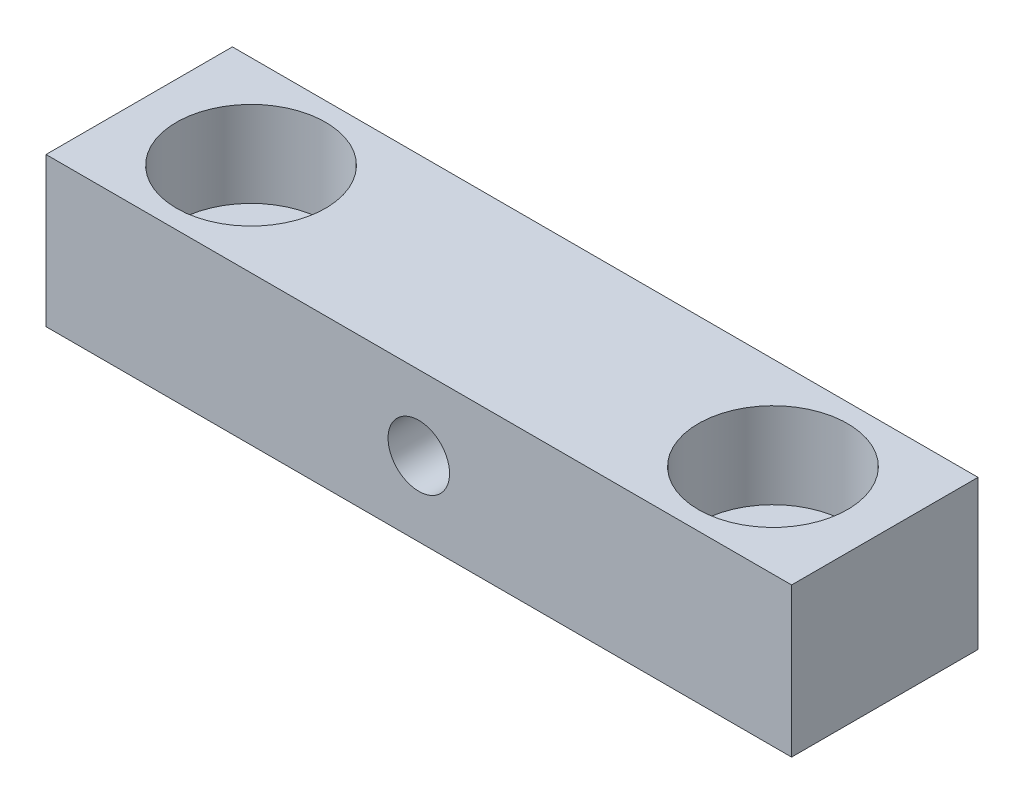
ISO-10303-21;
HEADER;
FILE_DESCRIPTION(('STEP AP214'),'2;1');
FILE_NAME('part.step','',(''),(''),'','','');
FILE_SCHEMA(('AUTOMOTIVE_DESIGN { 1 0 10303 214 1 1 1 1 }'));
ENDSEC;
DATA;
#1=APPLICATION_CONTEXT('core data for automotive mechanical design processes');
#2=APPLICATION_PROTOCOL_DEFINITION('international standard','automotive_design',2000,#1);
#3=PRODUCT_CONTEXT('',#1,'mechanical');
#4=PRODUCT('Part','Part','',(#3));
#5=PRODUCT_RELATED_PRODUCT_CATEGORY('part','',(#4));
#6=PRODUCT_DEFINITION_FORMATION('','',#4);
#7=PRODUCT_DEFINITION_CONTEXT('part definition',#1,'design');
#8=PRODUCT_DEFINITION('design','',#6,#7);
#9=PRODUCT_DEFINITION_SHAPE('','',#8);
#10=(LENGTH_UNIT() NAMED_UNIT(*) SI_UNIT(.MILLI.,.METRE.));
#11=(NAMED_UNIT(*) PLANE_ANGLE_UNIT() SI_UNIT($,.RADIAN.));
#12=(NAMED_UNIT(*) SI_UNIT($,.STERADIAN.) SOLID_ANGLE_UNIT());
#13=UNCERTAINTY_MEASURE_WITH_UNIT(LENGTH_MEASURE(1.E-05),#10,'distance_accuracy_value','');
#14=(GEOMETRIC_REPRESENTATION_CONTEXT(3) GLOBAL_UNCERTAINTY_ASSIGNED_CONTEXT((#13)) GLOBAL_UNIT_ASSIGNED_CONTEXT((#10,
#11,#12)) REPRESENTATION_CONTEXT('',''));
#15=CARTESIAN_POINT('',(0.,0.,0.));
#16=DIRECTION('',(0.,0.,1.));
#17=DIRECTION('',(1.,0.,0.));
#18=AXIS2_PLACEMENT_3D('',#15,#16,#17);
#19=CARTESIAN_POINT('',(20.,8.,5.));
#20=DIRECTION('',(-1.,0.,0.));
#21=DIRECTION('',(0.,0.,1.));
#22=AXIS2_PLACEMENT_3D('',#19,#20,#21);
#23=PLANE('',#22);
#24=DIRECTION('',(0.,0.,-1.));
#25=VECTOR('',#24,1.);
#26=CARTESIAN_POINT('',(20.,0.,5.));
#27=LINE('',#26,#25);
#28=CARTESIAN_POINT('',(20.,0.,5.));
#29=VERTEX_POINT('',#28);
#30=CARTESIAN_POINT('',(20.,0.,-5.));
#31=VERTEX_POINT('',#30);
#32=EDGE_CURVE('E111',#29,#31,#27,.T.);
#33=ORIENTED_EDGE('',*,*,#32,.T.);
#34=DIRECTION('',(0.,-1.,0.));
#35=VECTOR('',#34,1.);
#36=CARTESIAN_POINT('',(20.,8.,-5.));
#37=LINE('',#36,#35);
#38=CARTESIAN_POINT('',(20.,8.,-5.));
#39=VERTEX_POINT('',#38);
#40=EDGE_CURVE('E13',#39,#31,#37,.T.);
#41=ORIENTED_EDGE('',*,*,#40,.F.);
#42=DIRECTION('',(0.,0.,-1.));
#43=VECTOR('',#42,1.);
#44=CARTESIAN_POINT('',(20.,8.,5.));
#45=LINE('',#44,#43);
#46=CARTESIAN_POINT('',(20.,8.,5.));
#47=VERTEX_POINT('',#46);
#48=EDGE_CURVE('E99',#47,#39,#45,.T.);
#49=ORIENTED_EDGE('',*,*,#48,.F.);
#50=DIRECTION('',(0.,-1.,0.));
#51=VECTOR('',#50,1.);
#52=CARTESIAN_POINT('',(20.,8.,5.));
#53=LINE('',#52,#51);
#54=EDGE_CURVE('E107',#47,#29,#53,.T.);
#55=ORIENTED_EDGE('',*,*,#54,.T.);
#56=EDGE_LOOP('',(#33,#41,#49,#55));
#57=FACE_BOUND('',#56,.T.);
#58=ADVANCED_FACE('F48',(#57),#23,.F.);
#59=CARTESIAN_POINT('',(-20.,8.,-5.));
#60=DIRECTION('',(0.,0.,1.));
#61=DIRECTION('',(1.,0.,0.));
#62=AXIS2_PLACEMENT_3D('',#59,#60,#61);
#63=PLANE('',#62);
#64=CARTESIAN_POINT('',(0.,4.,-5.));
#65=DIRECTION('',(0.,0.,1.));
#66=DIRECTION('',(1.,0.,0.));
#67=AXIS2_PLACEMENT_3D('',#64,#65,#66);
#68=CIRCLE('',#67,1.64999999999999);
#69=CARTESIAN_POINT('',(1.64999999999999,4.,-5.));
#70=VERTEX_POINT('',#69);
#71=EDGE_CURVE('E148',#70,#70,#68,.T.);
#72=ORIENTED_EDGE('',*,*,#71,.T.);
#73=EDGE_LOOP('',(#72));
#74=FACE_BOUND('',#73,.T.);
#75=DIRECTION('',(-1.,0.,0.));
#76=VECTOR('',#75,1.);
#77=CARTESIAN_POINT('',(-20.,0.,-5.));
#78=LINE('',#77,#76);
#79=CARTESIAN_POINT('',(-20.,0.,-5.));
#80=VERTEX_POINT('',#79);
#81=EDGE_CURVE('E103',#31,#80,#78,.T.);
#82=ORIENTED_EDGE('',*,*,#81,.T.);
#83=DIRECTION('',(0.,-1.,0.));
#84=VECTOR('',#83,1.);
#85=CARTESIAN_POINT('',(-20.,8.,-5.));
#86=LINE('',#85,#84);
#87=CARTESIAN_POINT('',(-20.,8.,-5.));
#88=VERTEX_POINT('',#87);
#89=EDGE_CURVE('E56',#88,#80,#86,.T.);
#90=ORIENTED_EDGE('',*,*,#89,.F.);
#91=DIRECTION('',(-1.,0.,0.));
#92=VECTOR('',#91,1.);
#93=CARTESIAN_POINT('',(-20.,8.,-5.));
#94=LINE('',#93,#92);
#95=EDGE_CURVE('E94',#39,#88,#94,.T.);
#96=ORIENTED_EDGE('',*,*,#95,.F.);
#97=ORIENTED_EDGE('',*,*,#40,.T.);
#98=EDGE_LOOP('',(#82,#90,#96,#97));
#99=FACE_BOUND('',#98,.T.);
#100=ADVANCED_FACE('F102',(#74,#99),#63,.F.);
#101=CARTESIAN_POINT('',(-20.,8.,5.));
#102=DIRECTION('',(1.,0.,0.));
#103=DIRECTION('',(0.,0.,-1.));
#104=AXIS2_PLACEMENT_3D('',#101,#102,#103);
#105=PLANE('',#104);
#106=DIRECTION('',(0.,0.,1.));
#107=VECTOR('',#106,1.);
#108=CARTESIAN_POINT('',(-20.,0.,5.));
#109=LINE('',#108,#107);
#110=CARTESIAN_POINT('',(-20.,0.,5.));
#111=VERTEX_POINT('',#110);
#112=EDGE_CURVE('E81',#80,#111,#109,.T.);
#113=ORIENTED_EDGE('',*,*,#112,.T.);
#114=DIRECTION('',(0.,-1.,0.));
#115=VECTOR('',#114,1.);
#116=CARTESIAN_POINT('',(-20.,8.,5.));
#117=LINE('',#116,#115);
#118=CARTESIAN_POINT('',(-20.,8.,5.));
#119=VERTEX_POINT('',#118);
#120=EDGE_CURVE('E104',#119,#111,#117,.T.);
#121=ORIENTED_EDGE('',*,*,#120,.F.);
#122=DIRECTION('',(0.,0.,1.));
#123=VECTOR('',#122,1.);
#124=CARTESIAN_POINT('',(-20.,8.,5.));
#125=LINE('',#124,#123);
#126=EDGE_CURVE('E97',#88,#119,#125,.T.);
#127=ORIENTED_EDGE('',*,*,#126,.F.);
#128=ORIENTED_EDGE('',*,*,#89,.T.);
#129=EDGE_LOOP('',(#113,#121,#127,#128));
#130=FACE_BOUND('',#129,.T.);
#131=ADVANCED_FACE('F105',(#130),#105,.F.);
#132=CARTESIAN_POINT('',(-20.,8.,5.));
#133=DIRECTION('',(0.,0.,-1.));
#134=DIRECTION('',(-1.,0.,0.));
#135=AXIS2_PLACEMENT_3D('',#132,#133,#134);
#136=PLANE('',#135);
#137=CARTESIAN_POINT('',(0.,4.,5.));
#138=DIRECTION('',(0.,0.,1.));
#139=DIRECTION('',(1.,0.,0.));
#140=AXIS2_PLACEMENT_3D('',#137,#138,#139);
#141=CIRCLE('',#140,1.64999999999999);
#142=CARTESIAN_POINT('',(1.64999999999998,4.,5.));
#143=VERTEX_POINT('',#142);
#144=EDGE_CURVE('E151',#143,#143,#141,.T.);
#145=ORIENTED_EDGE('',*,*,#144,.F.);
#146=EDGE_LOOP('',(#145));
#147=FACE_BOUND('',#146,.T.);
#148=DIRECTION('',(1.,0.,0.));
#149=VECTOR('',#148,1.);
#150=CARTESIAN_POINT('',(-20.,0.,5.));
#151=LINE('',#150,#149);
#152=EDGE_CURVE('E87',#111,#29,#151,.T.);
#153=ORIENTED_EDGE('',*,*,#152,.T.);
#154=ORIENTED_EDGE('',*,*,#54,.F.);
#155=DIRECTION('',(1.,0.,0.));
#156=VECTOR('',#155,1.);
#157=CARTESIAN_POINT('',(-20.,8.,5.));
#158=LINE('',#157,#156);
#159=EDGE_CURVE('E64',#119,#47,#158,.T.);
#160=ORIENTED_EDGE('',*,*,#159,.F.);
#161=ORIENTED_EDGE('',*,*,#120,.T.);
#162=EDGE_LOOP('',(#153,#154,#160,#161));
#163=FACE_BOUND('',#162,.T.);
#164=ADVANCED_FACE('F119',(#147,#163),#136,.F.);
#165=CARTESIAN_POINT('',(0.,8.,0.));
#166=DIRECTION('',(0.,-1.,0.));
#167=DIRECTION('',(0.,0.,-1.));
#168=AXIS2_PLACEMENT_3D('',#165,#166,#167);
#169=PLANE('',#168);
#170=CARTESIAN_POINT('',(14.,8.,0.));
#171=DIRECTION('',(0.,1.,0.));
#172=DIRECTION('',(0.,0.,1.));
#173=AXIS2_PLACEMENT_3D('',#170,#171,#172);
#174=CIRCLE('',#173,4.);
#175=CARTESIAN_POINT('',(14.,8.,4.));
#176=VERTEX_POINT('',#175);
#177=EDGE_CURVE('E145',#176,#176,#174,.T.);
#178=ORIENTED_EDGE('',*,*,#177,.F.);
#179=EDGE_LOOP('',(#178));
#180=FACE_BOUND('',#179,.T.);
#181=CARTESIAN_POINT('',(-14.,8.,0.));
#182=DIRECTION('',(0.,1.,0.));
#183=DIRECTION('',(0.,0.,1.));
#184=AXIS2_PLACEMENT_3D('',#181,#182,#183);
#185=CIRCLE('',#184,4.);
#186=CARTESIAN_POINT('',(-14.,8.,4.));
#187=VERTEX_POINT('',#186);
#188=EDGE_CURVE('E133',#187,#187,#185,.T.);
#189=ORIENTED_EDGE('',*,*,#188,.F.);
#190=EDGE_LOOP('',(#189));
#191=FACE_BOUND('',#190,.T.);
#192=ORIENTED_EDGE('',*,*,#48,.T.);
#193=ORIENTED_EDGE('',*,*,#95,.T.);
#194=ORIENTED_EDGE('',*,*,#126,.T.);
#195=ORIENTED_EDGE('',*,*,#159,.T.);
#196=EDGE_LOOP('',(#192,#193,#194,#195));
#197=FACE_BOUND('',#196,.T.);
#198=ADVANCED_FACE('F95',(#180,#191,#197),#169,.F.);
#199=CARTESIAN_POINT('',(0.,0.,0.));
#200=DIRECTION('',(0.,-1.,0.));
#201=DIRECTION('',(0.,0.,-1.));
#202=AXIS2_PLACEMENT_3D('',#199,#200,#201);
#203=PLANE('',#202);
#204=CARTESIAN_POINT('',(14.,0.,0.));
#205=DIRECTION('',(0.,-1.,0.));
#206=DIRECTION('',(0.,0.,-1.));
#207=AXIS2_PLACEMENT_3D('',#204,#205,#206);
#208=CIRCLE('',#207,2.25);
#209=CARTESIAN_POINT('',(14.,0.,-2.25));
#210=VERTEX_POINT('',#209);
#211=EDGE_CURVE('E136',#210,#210,#208,.T.);
#212=ORIENTED_EDGE('',*,*,#211,.F.);
#213=EDGE_LOOP('',(#212));
#214=FACE_BOUND('',#213,.T.);
#215=CARTESIAN_POINT('',(-14.,0.,0.));
#216=DIRECTION('',(0.,-1.,0.));
#217=DIRECTION('',(0.,0.,-1.));
#218=AXIS2_PLACEMENT_3D('',#215,#216,#217);
#219=CIRCLE('',#218,2.25);
#220=CARTESIAN_POINT('',(-14.,0.,-2.25));
#221=VERTEX_POINT('',#220);
#222=EDGE_CURVE('E114',#221,#221,#219,.T.);
#223=ORIENTED_EDGE('',*,*,#222,.F.);
#224=EDGE_LOOP('',(#223));
#225=FACE_BOUND('',#224,.T.);
#226=ORIENTED_EDGE('',*,*,#32,.F.);
#227=ORIENTED_EDGE('',*,*,#152,.F.);
#228=ORIENTED_EDGE('',*,*,#112,.F.);
#229=ORIENTED_EDGE('',*,*,#81,.F.);
#230=EDGE_LOOP('',(#226,#227,#228,#229));
#231=FACE_BOUND('',#230,.T.);
#232=ADVANCED_FACE('F122',(#214,#225,#231),#203,.T.);
#233=CARTESIAN_POINT('',(-14.,8.,0.));
#234=DIRECTION('',(0.,1.,0.));
#235=DIRECTION('',(0.,0.,1.));
#236=AXIS2_PLACEMENT_3D('',#233,#234,#235);
#237=CYLINDRICAL_SURFACE('',#236,2.25);
#238=CARTESIAN_POINT('',(-14.,3.4,0.));
#239=DIRECTION('',(0.,1.,0.));
#240=DIRECTION('',(0.,0.,1.));
#241=AXIS2_PLACEMENT_3D('',#238,#239,#240);
#242=CIRCLE('',#241,2.25);
#243=CARTESIAN_POINT('',(-14.,3.4,2.25));
#244=VERTEX_POINT('',#243);
#245=EDGE_CURVE('E127',#244,#244,#242,.T.);
#246=ORIENTED_EDGE('',*,*,#245,.T.);
#247=EDGE_LOOP('',(#246));
#248=FACE_BOUND('',#247,.T.);
#249=ORIENTED_EDGE('',*,*,#222,.T.);
#250=EDGE_LOOP('',(#249));
#251=FACE_BOUND('',#250,.T.);
#252=ADVANCED_FACE('F200',(#248,#251),#237,.F.);
#253=CARTESIAN_POINT('',(-11.75,3.4,0.));
#254=DIRECTION('',(0.,-1.,0.));
#255=DIRECTION('',(0.,0.,-1.));
#256=AXIS2_PLACEMENT_3D('',#253,#254,#255);
#257=PLANE('',#256);
#258=ORIENTED_EDGE('',*,*,#245,.F.);
#259=EDGE_LOOP('',(#258));
#260=FACE_BOUND('',#259,.T.);
#261=CARTESIAN_POINT('',(-14.,3.4,0.));
#262=DIRECTION('',(0.,1.,0.));
#263=DIRECTION('',(0.,0.,1.));
#264=AXIS2_PLACEMENT_3D('',#261,#262,#263);
#265=CIRCLE('',#264,4.);
#266=CARTESIAN_POINT('',(-14.,3.4,4.));
#267=VERTEX_POINT('',#266);
#268=EDGE_CURVE('E130',#267,#267,#265,.T.);
#269=ORIENTED_EDGE('',*,*,#268,.T.);
#270=EDGE_LOOP('',(#269));
#271=FACE_BOUND('',#270,.T.);
#272=ADVANCED_FACE('F196',(#260,#271),#257,.F.);
#273=CARTESIAN_POINT('',(-14.,8.,0.));
#274=DIRECTION('',(0.,1.,0.));
#275=DIRECTION('',(0.,0.,1.));
#276=AXIS2_PLACEMENT_3D('',#273,#274,#275);
#277=CYLINDRICAL_SURFACE('',#276,4.);
#278=ORIENTED_EDGE('',*,*,#268,.F.);
#279=EDGE_LOOP('',(#278));
#280=FACE_BOUND('',#279,.T.);
#281=ORIENTED_EDGE('',*,*,#188,.T.);
#282=EDGE_LOOP('',(#281));
#283=FACE_BOUND('',#282,.T.);
#284=ADVANCED_FACE('F192',(#280,#283),#277,.F.);
#285=CARTESIAN_POINT('',(14.,8.,0.));
#286=DIRECTION('',(0.,1.,0.));
#287=DIRECTION('',(0.,0.,1.));
#288=AXIS2_PLACEMENT_3D('',#285,#286,#287);
#289=CYLINDRICAL_SURFACE('',#288,2.25);
#290=CARTESIAN_POINT('',(14.,3.4,0.));
#291=DIRECTION('',(0.,1.,0.));
#292=DIRECTION('',(0.,0.,1.));
#293=AXIS2_PLACEMENT_3D('',#290,#291,#292);
#294=CIRCLE('',#293,2.25);
#295=CARTESIAN_POINT('',(14.,3.4,2.25));
#296=VERTEX_POINT('',#295);
#297=EDGE_CURVE('E139',#296,#296,#294,.T.);
#298=ORIENTED_EDGE('',*,*,#297,.T.);
#299=EDGE_LOOP('',(#298));
#300=FACE_BOUND('',#299,.T.);
#301=ORIENTED_EDGE('',*,*,#211,.T.);
#302=EDGE_LOOP('',(#301));
#303=FACE_BOUND('',#302,.T.);
#304=ADVANCED_FACE('F188',(#300,#303),#289,.F.);
#305=CARTESIAN_POINT('',(16.25,3.4,0.));
#306=DIRECTION('',(0.,-1.,0.));
#307=DIRECTION('',(0.,0.,-1.));
#308=AXIS2_PLACEMENT_3D('',#305,#306,#307);
#309=PLANE('',#308);
#310=ORIENTED_EDGE('',*,*,#297,.F.);
#311=EDGE_LOOP('',(#310));
#312=FACE_BOUND('',#311,.T.);
#313=CARTESIAN_POINT('',(14.,3.4,0.));
#314=DIRECTION('',(0.,1.,0.));
#315=DIRECTION('',(0.,0.,1.));
#316=AXIS2_PLACEMENT_3D('',#313,#314,#315);
#317=CIRCLE('',#316,4.);
#318=CARTESIAN_POINT('',(14.,3.4,4.));
#319=VERTEX_POINT('',#318);
#320=EDGE_CURVE('E142',#319,#319,#317,.T.);
#321=ORIENTED_EDGE('',*,*,#320,.T.);
#322=EDGE_LOOP('',(#321));
#323=FACE_BOUND('',#322,.T.);
#324=ADVANCED_FACE('F182',(#312,#323),#309,.F.);
#325=CARTESIAN_POINT('',(14.,8.,0.));
#326=DIRECTION('',(0.,1.,0.));
#327=DIRECTION('',(0.,0.,1.));
#328=AXIS2_PLACEMENT_3D('',#325,#326,#327);
#329=CYLINDRICAL_SURFACE('',#328,4.);
#330=ORIENTED_EDGE('',*,*,#320,.F.);
#331=EDGE_LOOP('',(#330));
#332=FACE_BOUND('',#331,.T.);
#333=ORIENTED_EDGE('',*,*,#177,.T.);
#334=EDGE_LOOP('',(#333));
#335=FACE_BOUND('',#334,.T.);
#336=ADVANCED_FACE('F177',(#332,#335),#329,.F.);
#337=CARTESIAN_POINT('',(0.,4.,5.));
#338=DIRECTION('',(0.,0.,1.));
#339=DIRECTION('',(1.,0.,0.));
#340=AXIS2_PLACEMENT_3D('',#337,#338,#339);
#341=CYLINDRICAL_SURFACE('',#340,1.64999999999999);
#342=ORIENTED_EDGE('',*,*,#71,.F.);
#343=EDGE_LOOP('',(#342));
#344=FACE_BOUND('',#343,.T.);
#345=ORIENTED_EDGE('',*,*,#144,.T.);
#346=EDGE_LOOP('',(#345));
#347=FACE_BOUND('',#346,.T.);
#348=ADVANCED_FACE('F155',(#344,#347),#341,.F.);
#349=CLOSED_SHELL('',(#58,#100,#131,#164,#198,#232,#252,#272,#284,#304,#324,#336,#348));
#350=MANIFOLD_SOLID_BREP('B2',#349);
#351=ADVANCED_BREP_SHAPE_REPRESENTATION('',(#18,#350),#14);
#352=SHAPE_DEFINITION_REPRESENTATION(#9,#351);
ENDSEC;
END-ISO-10303-21;
